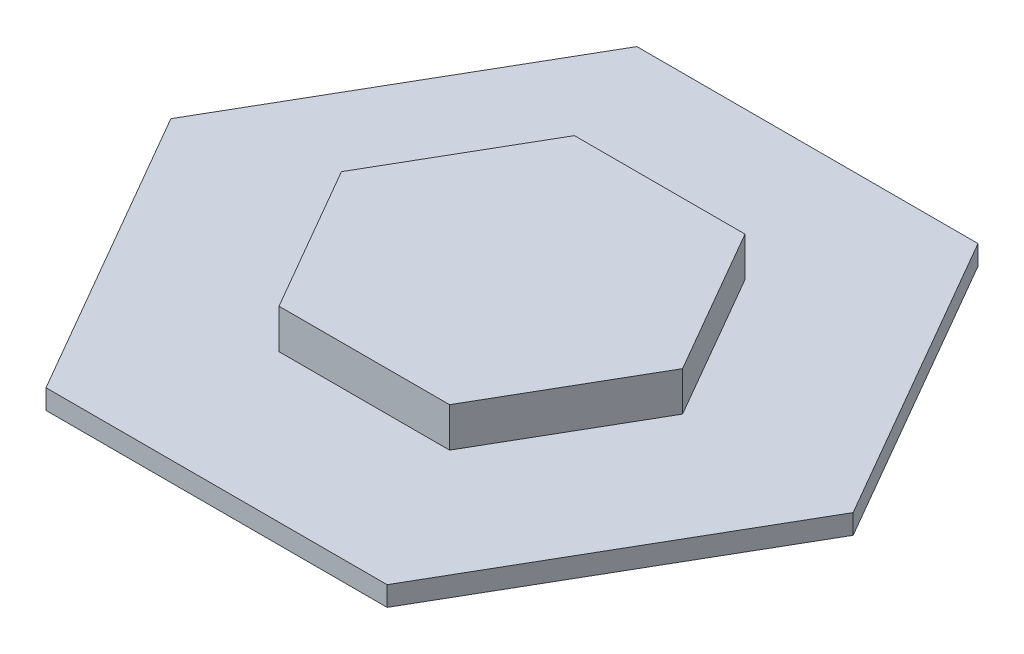
ISO-10303-21;
HEADER;
FILE_DESCRIPTION(('STEP AP214'),'2;1');
FILE_NAME('part.step','',(''),(''),'','','');
FILE_SCHEMA(('AUTOMOTIVE_DESIGN { 1 0 10303 214 1 1 1 1 }'));
ENDSEC;
DATA;
#1=APPLICATION_CONTEXT('core data for automotive mechanical design processes');
#2=APPLICATION_PROTOCOL_DEFINITION('international standard','automotive_design',2000,#1);
#3=PRODUCT_CONTEXT('',#1,'mechanical');
#4=PRODUCT('Part','Part','',(#3));
#5=PRODUCT_RELATED_PRODUCT_CATEGORY('part','',(#4));
#6=PRODUCT_DEFINITION_FORMATION('','',#4);
#7=PRODUCT_DEFINITION_CONTEXT('part definition',#1,'design');
#8=PRODUCT_DEFINITION('design','',#6,#7);
#9=PRODUCT_DEFINITION_SHAPE('','',#8);
#10=(LENGTH_UNIT() NAMED_UNIT(*) SI_UNIT(.MILLI.,.METRE.));
#11=(NAMED_UNIT(*) PLANE_ANGLE_UNIT() SI_UNIT($,.RADIAN.));
#12=(NAMED_UNIT(*) SI_UNIT($,.STERADIAN.) SOLID_ANGLE_UNIT());
#13=UNCERTAINTY_MEASURE_WITH_UNIT(LENGTH_MEASURE(1.E-05),#10,'distance_accuracy_value','');
#14=(GEOMETRIC_REPRESENTATION_CONTEXT(3) GLOBAL_UNCERTAINTY_ASSIGNED_CONTEXT((#13)) GLOBAL_UNIT_ASSIGNED_CONTEXT((#10,
#11,#12)) REPRESENTATION_CONTEXT('',''));
#15=CARTESIAN_POINT('',(0.,0.,0.));
#16=DIRECTION('',(0.,0.,1.));
#17=DIRECTION('',(1.,0.,0.));
#18=AXIS2_PLACEMENT_3D('',#15,#16,#17);
#19=CARTESIAN_POINT('',(0.,1.,0.));
#20=DIRECTION('',(0.,1.,0.));
#21=DIRECTION('',(0.,0.,1.));
#22=AXIS2_PLACEMENT_3D('',#19,#20,#21);
#23=PLANE('',#22);
#24=DIRECTION('',(0.5,0.,-0.866025403784439));
#25=VECTOR('',#24,1.);
#26=CARTESIAN_POINT('',(8.66025403784439,1.,15.));
#27=LINE('',#26,#25);
#28=CARTESIAN_POINT('',(8.66025403784439,1.,15.));
#29=VERTEX_POINT('',#28);
#30=CARTESIAN_POINT('',(17.3205080756888,1.,0.));
#31=VERTEX_POINT('',#30);
#32=EDGE_CURVE('E136',#29,#31,#27,.T.);
#33=ORIENTED_EDGE('',*,*,#32,.T.);
#34=DIRECTION('',(-0.5,0.,-0.866025403784438));
#35=VECTOR('',#34,1.);
#36=CARTESIAN_POINT('',(17.3205080756888,1.,0.));
#37=LINE('',#36,#35);
#38=CARTESIAN_POINT('',(8.66025403784438,1.,-15.));
#39=VERTEX_POINT('',#38);
#40=EDGE_CURVE('E96',#31,#39,#37,.T.);
#41=ORIENTED_EDGE('',*,*,#40,.T.);
#42=DIRECTION('',(-1.,0.,0.));
#43=VECTOR('',#42,1.);
#44=CARTESIAN_POINT('',(8.66025403784438,1.,-15.));
#45=LINE('',#44,#43);
#46=CARTESIAN_POINT('',(-8.66025403784438,1.,-15.));
#47=VERTEX_POINT('',#46);
#48=EDGE_CURVE('E112',#39,#47,#45,.T.);
#49=ORIENTED_EDGE('',*,*,#48,.T.);
#50=DIRECTION('',(-0.5,0.,0.866025403784439));
#51=VECTOR('',#50,1.);
#52=CARTESIAN_POINT('',(-8.66025403784438,1.,-15.));
#53=LINE('',#52,#51);
#54=CARTESIAN_POINT('',(-17.3205080756888,1.,0.));
#55=VERTEX_POINT('',#54);
#56=EDGE_CURVE('E104',#47,#55,#53,.T.);
#57=ORIENTED_EDGE('',*,*,#56,.T.);
#58=DIRECTION('',(0.5,0.,0.866025403784438));
#59=VECTOR('',#58,1.);
#60=CARTESIAN_POINT('',(-17.3205080756888,1.,0.));
#61=LINE('',#60,#59);
#62=CARTESIAN_POINT('',(-8.66025403784438,1.,15.));
#63=VERTEX_POINT('',#62);
#64=EDGE_CURVE('E108',#55,#63,#61,.T.);
#65=ORIENTED_EDGE('',*,*,#64,.T.);
#66=DIRECTION('',(1.,0.,0.));
#67=VECTOR('',#66,1.);
#68=CARTESIAN_POINT('',(-8.66025403784438,1.,15.));
#69=LINE('',#68,#67);
#70=EDGE_CURVE('E59',#63,#29,#69,.T.);
#71=ORIENTED_EDGE('',*,*,#70,.T.);
#72=EDGE_LOOP('',(#33,#41,#49,#57,#65,#71));
#73=FACE_BOUND('',#72,.T.);
#74=DIRECTION('',(-0.5,0.,-0.866025403784439));
#75=VECTOR('',#74,1.);
#76=CARTESIAN_POINT('',(8.66025403784439,1.,0.));
#77=LINE('',#76,#75);
#78=CARTESIAN_POINT('',(8.66025403784439,1.,0.));
#79=VERTEX_POINT('',#78);
#80=CARTESIAN_POINT('',(4.3301270189222,1.,-7.5));
#81=VERTEX_POINT('',#80);
#82=EDGE_CURVE('E245',#79,#81,#77,.T.);
#83=ORIENTED_EDGE('',*,*,#82,.F.);
#84=DIRECTION('',(0.5,0.,-0.866025403784439));
#85=VECTOR('',#84,1.);
#86=CARTESIAN_POINT('',(4.33012701892219,1.,7.5));
#87=LINE('',#86,#85);
#88=CARTESIAN_POINT('',(4.33012701892219,1.,7.5));
#89=VERTEX_POINT('',#88);
#90=EDGE_CURVE('E243',#89,#79,#87,.T.);
#91=ORIENTED_EDGE('',*,*,#90,.F.);
#92=DIRECTION('',(1.,0.,0.));
#93=VECTOR('',#92,1.);
#94=CARTESIAN_POINT('',(-4.33012701892219,1.,7.5));
#95=LINE('',#94,#93);
#96=CARTESIAN_POINT('',(-4.33012701892219,1.,7.5));
#97=VERTEX_POINT('',#96);
#98=EDGE_CURVE('E132',#97,#89,#95,.T.);
#99=ORIENTED_EDGE('',*,*,#98,.F.);
#100=DIRECTION('',(0.5,0.,0.866025403784439));
#101=VECTOR('',#100,1.);
#102=CARTESIAN_POINT('',(-8.66025403784439,1.,0.));
#103=LINE('',#102,#101);
#104=CARTESIAN_POINT('',(-8.66025403784439,1.,0.));
#105=VERTEX_POINT('',#104);
#106=EDGE_CURVE('E203',#105,#97,#103,.T.);
#107=ORIENTED_EDGE('',*,*,#106,.F.);
#108=DIRECTION('',(-0.5,0.,0.866025403784439));
#109=VECTOR('',#108,1.);
#110=CARTESIAN_POINT('',(-4.33012701892219,1.,-7.5));
#111=LINE('',#110,#109);
#112=CARTESIAN_POINT('',(-4.33012701892219,1.,-7.5));
#113=VERTEX_POINT('',#112);
#114=EDGE_CURVE('E214',#113,#105,#111,.T.);
#115=ORIENTED_EDGE('',*,*,#114,.F.);
#116=DIRECTION('',(-1.,0.,0.));
#117=VECTOR('',#116,1.);
#118=CARTESIAN_POINT('',(4.3301270189222,1.,-7.5));
#119=LINE('',#118,#117);
#120=EDGE_CURVE('E250',#81,#113,#119,.T.);
#121=ORIENTED_EDGE('',*,*,#120,.F.);
#122=EDGE_LOOP('',(#83,#91,#99,#107,#115,#121));
#123=FACE_BOUND('',#122,.T.);
#124=ADVANCED_FACE('F41',(#73,#123),#23,.T.);
#125=CARTESIAN_POINT('',(0.,0.,0.));
#126=DIRECTION('',(0.,1.,0.));
#127=DIRECTION('',(0.,0.,1.));
#128=AXIS2_PLACEMENT_3D('',#125,#126,#127);
#129=PLANE('',#128);
#130=DIRECTION('',(0.5,0.,-0.866025403784439));
#131=VECTOR('',#130,1.);
#132=CARTESIAN_POINT('',(8.66025403784439,0.,15.));
#133=LINE('',#132,#131);
#134=CARTESIAN_POINT('',(8.66025403784439,0.,15.));
#135=VERTEX_POINT('',#134);
#136=CARTESIAN_POINT('',(17.3205080756888,0.,0.));
#137=VERTEX_POINT('',#136);
#138=EDGE_CURVE('E129',#135,#137,#133,.T.);
#139=ORIENTED_EDGE('',*,*,#138,.F.);
#140=DIRECTION('',(1.,0.,0.));
#141=VECTOR('',#140,1.);
#142=CARTESIAN_POINT('',(-8.66025403784438,0.,15.));
#143=LINE('',#142,#141);
#144=CARTESIAN_POINT('',(-8.66025403784438,0.,15.));
#145=VERTEX_POINT('',#144);
#146=EDGE_CURVE('E86',#145,#135,#143,.T.);
#147=ORIENTED_EDGE('',*,*,#146,.F.);
#148=DIRECTION('',(0.5,0.,0.866025403784438));
#149=VECTOR('',#148,1.);
#150=CARTESIAN_POINT('',(-17.3205080756888,0.,0.));
#151=LINE('',#150,#149);
#152=CARTESIAN_POINT('',(-17.3205080756888,0.,0.));
#153=VERTEX_POINT('',#152);
#154=EDGE_CURVE('E85',#153,#145,#151,.T.);
#155=ORIENTED_EDGE('',*,*,#154,.F.);
#156=DIRECTION('',(-0.5,0.,0.866025403784439));
#157=VECTOR('',#156,1.);
#158=CARTESIAN_POINT('',(-8.66025403784438,0.,-15.));
#159=LINE('',#158,#157);
#160=CARTESIAN_POINT('',(-8.66025403784438,0.,-15.));
#161=VERTEX_POINT('',#160);
#162=EDGE_CURVE('E120',#161,#153,#159,.T.);
#163=ORIENTED_EDGE('',*,*,#162,.F.);
#164=DIRECTION('',(-1.,0.,0.));
#165=VECTOR('',#164,1.);
#166=CARTESIAN_POINT('',(8.66025403784438,0.,-15.));
#167=LINE('',#166,#165);
#168=CARTESIAN_POINT('',(8.66025403784438,0.,-15.));
#169=VERTEX_POINT('',#168);
#170=EDGE_CURVE('E131',#169,#161,#167,.T.);
#171=ORIENTED_EDGE('',*,*,#170,.F.);
#172=DIRECTION('',(-0.5,0.,-0.866025403784438));
#173=VECTOR('',#172,1.);
#174=CARTESIAN_POINT('',(17.3205080756888,0.,0.));
#175=LINE('',#174,#173);
#176=EDGE_CURVE('E134',#137,#169,#175,.T.);
#177=ORIENTED_EDGE('',*,*,#176,.F.);
#178=EDGE_LOOP('',(#139,#147,#155,#163,#171,#177));
#179=FACE_BOUND('',#178,.T.);
#180=ADVANCED_FACE('F149',(#179),#129,.F.);
#181=CARTESIAN_POINT('',(8.66025403784439,1.,15.));
#182=DIRECTION('',(-0.866025403784439,0.,-0.5));
#183=DIRECTION('',(-0.5,0.,0.866025403784439));
#184=AXIS2_PLACEMENT_3D('',#181,#182,#183);
#185=PLANE('',#184);
#186=ORIENTED_EDGE('',*,*,#138,.T.);
#187=DIRECTION('',(0.,-1.,0.));
#188=VECTOR('',#187,1.);
#189=CARTESIAN_POINT('',(17.3205080756888,1.,0.));
#190=LINE('',#189,#188);
#191=EDGE_CURVE('E11',#31,#137,#190,.T.);
#192=ORIENTED_EDGE('',*,*,#191,.F.);
#193=ORIENTED_EDGE('',*,*,#32,.F.);
#194=DIRECTION('',(0.,-1.,0.));
#195=VECTOR('',#194,1.);
#196=CARTESIAN_POINT('',(8.66025403784439,1.,15.));
#197=LINE('',#196,#195);
#198=EDGE_CURVE('E121',#29,#135,#197,.T.);
#199=ORIENTED_EDGE('',*,*,#198,.T.);
#200=EDGE_LOOP('',(#186,#192,#193,#199));
#201=FACE_BOUND('',#200,.T.);
#202=ADVANCED_FACE('F43',(#201),#185,.F.);
#203=CARTESIAN_POINT('',(17.3205080756888,1.,0.));
#204=DIRECTION('',(-0.866025403784438,0.,0.5));
#205=DIRECTION('',(0.5,0.,0.866025403784438));
#206=AXIS2_PLACEMENT_3D('',#203,#204,#205);
#207=PLANE('',#206);
#208=ORIENTED_EDGE('',*,*,#176,.T.);
#209=DIRECTION('',(0.,-1.,0.));
#210=VECTOR('',#209,1.);
#211=CARTESIAN_POINT('',(8.66025403784438,1.,-15.));
#212=LINE('',#211,#210);
#213=EDGE_CURVE('E49',#39,#169,#212,.T.);
#214=ORIENTED_EDGE('',*,*,#213,.F.);
#215=ORIENTED_EDGE('',*,*,#40,.F.);
#216=ORIENTED_EDGE('',*,*,#191,.T.);
#217=EDGE_LOOP('',(#208,#214,#215,#216));
#218=FACE_BOUND('',#217,.T.);
#219=ADVANCED_FACE('F354',(#218),#207,.F.);
#220=CARTESIAN_POINT('',(8.66025403784438,1.,-15.));
#221=DIRECTION('',(0.,0.,1.));
#222=DIRECTION('',(1.,0.,0.));
#223=AXIS2_PLACEMENT_3D('',#220,#221,#222);
#224=PLANE('',#223);
#225=ORIENTED_EDGE('',*,*,#170,.T.);
#226=DIRECTION('',(0.,-1.,0.));
#227=VECTOR('',#226,1.);
#228=CARTESIAN_POINT('',(-8.66025403784438,1.,-15.));
#229=LINE('',#228,#227);
#230=EDGE_CURVE('E116',#47,#161,#229,.T.);
#231=ORIENTED_EDGE('',*,*,#230,.F.);
#232=ORIENTED_EDGE('',*,*,#48,.F.);
#233=ORIENTED_EDGE('',*,*,#213,.T.);
#234=EDGE_LOOP('',(#225,#231,#232,#233));
#235=FACE_BOUND('',#234,.T.);
#236=ADVANCED_FACE('F148',(#235),#224,.F.);
#237=CARTESIAN_POINT('',(-8.66025403784438,1.,-15.));
#238=DIRECTION('',(0.866025403784439,0.,0.5));
#239=DIRECTION('',(0.5,0.,-0.866025403784439));
#240=AXIS2_PLACEMENT_3D('',#237,#238,#239);
#241=PLANE('',#240);
#242=ORIENTED_EDGE('',*,*,#162,.T.);
#243=DIRECTION('',(0.,-1.,0.));
#244=VECTOR('',#243,1.);
#245=CARTESIAN_POINT('',(-17.3205080756888,1.,0.));
#246=LINE('',#245,#244);
#247=EDGE_CURVE('E118',#55,#153,#246,.T.);
#248=ORIENTED_EDGE('',*,*,#247,.F.);
#249=ORIENTED_EDGE('',*,*,#56,.F.);
#250=ORIENTED_EDGE('',*,*,#230,.T.);
#251=EDGE_LOOP('',(#242,#248,#249,#250));
#252=FACE_BOUND('',#251,.T.);
#253=ADVANCED_FACE('F119',(#252),#241,.F.);
#254=CARTESIAN_POINT('',(-17.3205080756888,1.,0.));
#255=DIRECTION('',(0.866025403784438,0.,-0.5));
#256=DIRECTION('',(-0.5,0.,-0.866025403784438));
#257=AXIS2_PLACEMENT_3D('',#254,#255,#256);
#258=PLANE('',#257);
#259=ORIENTED_EDGE('',*,*,#154,.T.);
#260=DIRECTION('',(0.,-1.,0.));
#261=VECTOR('',#260,1.);
#262=CARTESIAN_POINT('',(-8.66025403784438,1.,15.));
#263=LINE('',#262,#261);
#264=EDGE_CURVE('E122',#63,#145,#263,.T.);
#265=ORIENTED_EDGE('',*,*,#264,.F.);
#266=ORIENTED_EDGE('',*,*,#64,.F.);
#267=ORIENTED_EDGE('',*,*,#247,.T.);
#268=EDGE_LOOP('',(#259,#265,#266,#267));
#269=FACE_BOUND('',#268,.T.);
#270=ADVANCED_FACE('F123',(#269),#258,.F.);
#271=CARTESIAN_POINT('',(-8.66025403784438,1.,15.));
#272=DIRECTION('',(0.,0.,-1.));
#273=DIRECTION('',(-1.,0.,0.));
#274=AXIS2_PLACEMENT_3D('',#271,#272,#273);
#275=PLANE('',#274);
#276=ORIENTED_EDGE('',*,*,#146,.T.);
#277=ORIENTED_EDGE('',*,*,#198,.F.);
#278=ORIENTED_EDGE('',*,*,#70,.F.);
#279=ORIENTED_EDGE('',*,*,#264,.T.);
#280=EDGE_LOOP('',(#276,#277,#278,#279));
#281=FACE_BOUND('',#280,.T.);
#282=ADVANCED_FACE('F153',(#281),#275,.F.);
#283=CARTESIAN_POINT('',(0.,3.,0.));
#284=DIRECTION('',(0.,1.,0.));
#285=DIRECTION('',(0.,0.,1.));
#286=AXIS2_PLACEMENT_3D('',#283,#284,#285);
#287=PLANE('',#286);
#288=DIRECTION('',(1.,0.,0.));
#289=VECTOR('',#288,1.);
#290=CARTESIAN_POINT('',(0.,3.,7.5));
#291=LINE('',#290,#289);
#292=CARTESIAN_POINT('',(-4.33012701892219,3.,7.5));
#293=VERTEX_POINT('',#292);
#294=CARTESIAN_POINT('',(4.33012701892219,3.,7.5));
#295=VERTEX_POINT('',#294);
#296=EDGE_CURVE('E222',#293,#295,#291,.T.);
#297=ORIENTED_EDGE('',*,*,#296,.T.);
#298=DIRECTION('',(0.5,0.,-0.866025403784439));
#299=VECTOR('',#298,1.);
#300=CARTESIAN_POINT('',(6.49519052838329,3.,3.75));
#301=LINE('',#300,#299);
#302=CARTESIAN_POINT('',(8.66025403784439,3.,0.));
#303=VERTEX_POINT('',#302);
#304=EDGE_CURVE('E281',#295,#303,#301,.T.);
#305=ORIENTED_EDGE('',*,*,#304,.T.);
#306=DIRECTION('',(-0.5,0.,-0.866025403784439));
#307=VECTOR('',#306,1.);
#308=CARTESIAN_POINT('',(6.49519052838329,3.,-3.75));
#309=LINE('',#308,#307);
#310=CARTESIAN_POINT('',(4.33012701892219,3.,-7.5));
#311=VERTEX_POINT('',#310);
#312=EDGE_CURVE('E271',#303,#311,#309,.T.);
#313=ORIENTED_EDGE('',*,*,#312,.T.);
#314=DIRECTION('',(-1.,0.,0.));
#315=VECTOR('',#314,1.);
#316=CARTESIAN_POINT('',(0.,3.,-7.5));
#317=LINE('',#316,#315);
#318=CARTESIAN_POINT('',(-4.33012701892219,3.,-7.5));
#319=VERTEX_POINT('',#318);
#320=EDGE_CURVE('E266',#311,#319,#317,.T.);
#321=ORIENTED_EDGE('',*,*,#320,.T.);
#322=DIRECTION('',(-0.5,0.,0.866025403784439));
#323=VECTOR('',#322,1.);
#324=CARTESIAN_POINT('',(-6.49519052838329,3.,-3.75));
#325=LINE('',#324,#323);
#326=CARTESIAN_POINT('',(-8.66025403784439,3.,0.));
#327=VERTEX_POINT('',#326);
#328=EDGE_CURVE('E229',#319,#327,#325,.T.);
#329=ORIENTED_EDGE('',*,*,#328,.T.);
#330=DIRECTION('',(0.5,0.,0.866025403784439));
#331=VECTOR('',#330,1.);
#332=CARTESIAN_POINT('',(-6.49519052838329,3.,3.75));
#333=LINE('',#332,#331);
#334=EDGE_CURVE('E225',#327,#293,#333,.T.);
#335=ORIENTED_EDGE('',*,*,#334,.T.);
#336=EDGE_LOOP('',(#297,#305,#313,#321,#329,#335));
#337=FACE_BOUND('',#336,.T.);
#338=ADVANCED_FACE('F154',(#337),#287,.T.);
#339=CARTESIAN_POINT('',(-6.49519052838329,3.,3.75));
#340=DIRECTION('',(0.866025403784439,0.,-0.5));
#341=DIRECTION('',(-0.5,0.,-0.866025403784439));
#342=AXIS2_PLACEMENT_3D('',#339,#340,#341);
#343=PLANE('',#342);
#344=ORIENTED_EDGE('',*,*,#106,.T.);
#345=DIRECTION('',(0.,-1.,0.));
#346=VECTOR('',#345,1.);
#347=CARTESIAN_POINT('',(-4.33012701892219,3.,7.5));
#348=LINE('',#347,#346);
#349=EDGE_CURVE('E202',#293,#97,#348,.T.);
#350=ORIENTED_EDGE('',*,*,#349,.F.);
#351=ORIENTED_EDGE('',*,*,#334,.F.);
#352=DIRECTION('',(0.,-1.,0.));
#353=VECTOR('',#352,1.);
#354=CARTESIAN_POINT('',(-8.66025403784439,3.,0.));
#355=LINE('',#354,#353);
#356=EDGE_CURVE('E207',#327,#105,#355,.T.);
#357=ORIENTED_EDGE('',*,*,#356,.T.);
#358=EDGE_LOOP('',(#344,#350,#351,#357));
#359=FACE_BOUND('',#358,.T.);
#360=ADVANCED_FACE('F165',(#359),#343,.F.);
#361=CARTESIAN_POINT('',(-6.49519052838329,3.,-3.75));
#362=DIRECTION('',(0.866025403784438,0.,0.5));
#363=DIRECTION('',(0.5,0.,-0.866025403784439));
#364=AXIS2_PLACEMENT_3D('',#361,#362,#363);
#365=PLANE('',#364);
#366=ORIENTED_EDGE('',*,*,#114,.T.);
#367=ORIENTED_EDGE('',*,*,#356,.F.);
#368=ORIENTED_EDGE('',*,*,#328,.F.);
#369=DIRECTION('',(0.,-1.,0.));
#370=VECTOR('',#369,1.);
#371=CARTESIAN_POINT('',(-4.33012701892219,3.,-7.5));
#372=LINE('',#371,#370);
#373=EDGE_CURVE('E221',#319,#113,#372,.T.);
#374=ORIENTED_EDGE('',*,*,#373,.T.);
#375=EDGE_LOOP('',(#366,#367,#368,#374));
#376=FACE_BOUND('',#375,.T.);
#377=ADVANCED_FACE('F189',(#376),#365,.F.);
#378=CARTESIAN_POINT('',(0.,3.,-7.5));
#379=DIRECTION('',(0.,0.,1.));
#380=DIRECTION('',(1.,0.,0.));
#381=AXIS2_PLACEMENT_3D('',#378,#379,#380);
#382=PLANE('',#381);
#383=ORIENTED_EDGE('',*,*,#120,.T.);
#384=ORIENTED_EDGE('',*,*,#373,.F.);
#385=ORIENTED_EDGE('',*,*,#320,.F.);
#386=DIRECTION('',(0.,-1.,0.));
#387=VECTOR('',#386,1.);
#388=CARTESIAN_POINT('',(4.33012701892219,3.,-7.5));
#389=LINE('',#388,#387);
#390=EDGE_CURVE('E233',#311,#81,#389,.T.);
#391=ORIENTED_EDGE('',*,*,#390,.T.);
#392=EDGE_LOOP('',(#383,#384,#385,#391));
#393=FACE_BOUND('',#392,.T.);
#394=ADVANCED_FACE('F181',(#393),#382,.F.);
#395=CARTESIAN_POINT('',(6.49519052838329,3.,-3.75));
#396=DIRECTION('',(-0.866025403784439,0.,0.5));
#397=DIRECTION('',(0.5,0.,0.866025403784439));
#398=AXIS2_PLACEMENT_3D('',#395,#396,#397);
#399=PLANE('',#398);
#400=ORIENTED_EDGE('',*,*,#82,.T.);
#401=ORIENTED_EDGE('',*,*,#390,.F.);
#402=ORIENTED_EDGE('',*,*,#312,.F.);
#403=DIRECTION('',(0.,-1.,0.));
#404=VECTOR('',#403,1.);
#405=CARTESIAN_POINT('',(8.66025403784439,3.,0.));
#406=LINE('',#405,#404);
#407=EDGE_CURVE('E237',#303,#79,#406,.T.);
#408=ORIENTED_EDGE('',*,*,#407,.T.);
#409=EDGE_LOOP('',(#400,#401,#402,#408));
#410=FACE_BOUND('',#409,.T.);
#411=ADVANCED_FACE('F179',(#410),#399,.F.);
#412=CARTESIAN_POINT('',(6.49519052838329,3.,3.75));
#413=DIRECTION('',(-0.866025403784439,0.,-0.5));
#414=DIRECTION('',(-0.5,0.,0.866025403784439));
#415=AXIS2_PLACEMENT_3D('',#412,#413,#414);
#416=PLANE('',#415);
#417=ORIENTED_EDGE('',*,*,#90,.T.);
#418=ORIENTED_EDGE('',*,*,#407,.F.);
#419=ORIENTED_EDGE('',*,*,#304,.F.);
#420=DIRECTION('',(0.,-1.,0.));
#421=VECTOR('',#420,1.);
#422=CARTESIAN_POINT('',(4.33012701892219,3.,7.5));
#423=LINE('',#422,#421);
#424=EDGE_CURVE('E239',#295,#89,#423,.T.);
#425=ORIENTED_EDGE('',*,*,#424,.T.);
#426=EDGE_LOOP('',(#417,#418,#419,#425));
#427=FACE_BOUND('',#426,.T.);
#428=ADVANCED_FACE('F171',(#427),#416,.F.);
#429=CARTESIAN_POINT('',(0.,3.,7.5));
#430=DIRECTION('',(0.,0.,-1.));
#431=DIRECTION('',(-1.,0.,0.));
#432=AXIS2_PLACEMENT_3D('',#429,#430,#431);
#433=PLANE('',#432);
#434=ORIENTED_EDGE('',*,*,#98,.T.);
#435=ORIENTED_EDGE('',*,*,#424,.F.);
#436=ORIENTED_EDGE('',*,*,#296,.F.);
#437=ORIENTED_EDGE('',*,*,#349,.T.);
#438=EDGE_LOOP('',(#434,#435,#436,#437));
#439=FACE_BOUND('',#438,.T.);
#440=ADVANCED_FACE('F174',(#439),#433,.F.);
#441=CLOSED_SHELL('',(#124,#180,#202,#219,#236,#253,#270,#282,#338,#360,#377,#394,#411,#428,#440));
#442=MANIFOLD_SOLID_BREP('B2',#441);
#443=ADVANCED_BREP_SHAPE_REPRESENTATION('',(#18,#442),#14);
#444=SHAPE_DEFINITION_REPRESENTATION(#9,#443);
ENDSEC;
END-ISO-10303-21;
